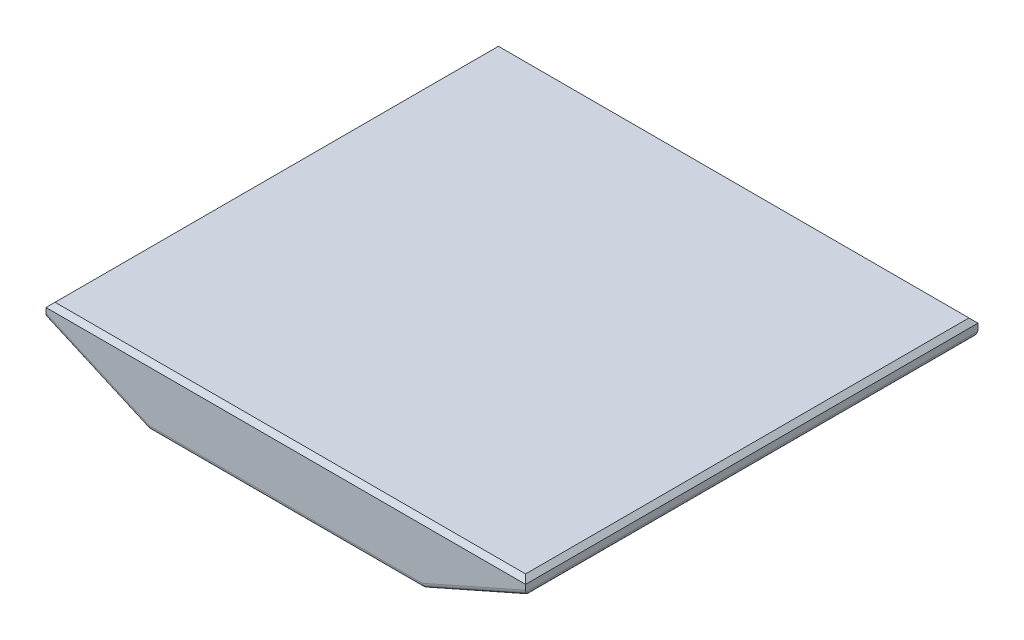
ISO-10303-21;
HEADER;
FILE_DESCRIPTION(('STEP AP214'),'2;1');
FILE_NAME('part.step','',(''),(''),'','','');
FILE_SCHEMA(('AUTOMOTIVE_DESIGN { 1 0 10303 214 1 1 1 1 }'));
ENDSEC;
DATA;
#1=APPLICATION_CONTEXT('core data for automotive mechanical design processes');
#2=APPLICATION_PROTOCOL_DEFINITION('international standard','automotive_design',2000,#1);
#3=PRODUCT_CONTEXT('',#1,'mechanical');
#4=PRODUCT('Part','Part','',(#3));
#5=PRODUCT_RELATED_PRODUCT_CATEGORY('part','',(#4));
#6=PRODUCT_DEFINITION_FORMATION('','',#4);
#7=PRODUCT_DEFINITION_CONTEXT('part definition',#1,'design');
#8=PRODUCT_DEFINITION('design','',#6,#7);
#9=PRODUCT_DEFINITION_SHAPE('','',#8);
#10=(LENGTH_UNIT() NAMED_UNIT(*) SI_UNIT(.MILLI.,.METRE.));
#11=(NAMED_UNIT(*) PLANE_ANGLE_UNIT() SI_UNIT($,.RADIAN.));
#12=(NAMED_UNIT(*) SI_UNIT($,.STERADIAN.) SOLID_ANGLE_UNIT());
#13=UNCERTAINTY_MEASURE_WITH_UNIT(LENGTH_MEASURE(1.E-05),#10,'distance_accuracy_value','');
#14=(GEOMETRIC_REPRESENTATION_CONTEXT(3) GLOBAL_UNCERTAINTY_ASSIGNED_CONTEXT((#13)) GLOBAL_UNIT_ASSIGNED_CONTEXT((#10,
#11,#12)) REPRESENTATION_CONTEXT('',''));
#15=CARTESIAN_POINT('',(0.,0.,0.));
#16=DIRECTION('',(0.,0.,1.));
#17=DIRECTION('',(1.,0.,0.));
#18=AXIS2_PLACEMENT_3D('',#15,#16,#17);
#19=CARTESIAN_POINT('',(26.5,0.,50.));
#20=DIRECTION('',(-1.,0.,0.));
#21=DIRECTION('',(0.,0.,1.));
#22=AXIS2_PLACEMENT_3D('',#19,#20,#21);
#23=PLANE('',#22);
#24=DIRECTION('',(0.,1.,0.));
#25=VECTOR('',#24,1.);
#26=CARTESIAN_POINT('',(26.5,0.,50.));
#27=LINE('',#26,#25);
#28=CARTESIAN_POINT('',(26.5,-1.05323984443737,50.));
#29=VERTEX_POINT('',#28);
#30=CARTESIAN_POINT('',(26.5,-0.499999999999987,50.));
#31=VERTEX_POINT('',#30);
#32=EDGE_CURVE('E381',#29,#31,#27,.T.);
#33=ORIENTED_EDGE('',*,*,#32,.F.);
#34=CARTESIAN_POINT('',(26.5,-1.05323984443737,49.5));
#35=DIRECTION('',(-1.,0.,0.));
#36=DIRECTION('',(0.,1.,0.));
#37=AXIS2_PLACEMENT_3D('',#34,#35,#36);
#38=ELLIPSE('',#37,0.546760155562622,0.5);
#39=CARTESIAN_POINT('',(26.5,-1.27447878249047,49.9572388778819));
#40=VERTEX_POINT('',#39);
#41=EDGE_CURVE('E227',#29,#40,#38,.F.);
#42=ORIENTED_EDGE('',*,*,#41,.T.);
#43=DIRECTION('',(0.,0.,-1.));
#44=VECTOR('',#43,1.);
#45=CARTESIAN_POINT('',(26.5,-1.27447878249047,50.));
#46=LINE('',#45,#44);
#47=CARTESIAN_POINT('',(26.5,-1.27447878249047,0.0427611221180749));
#48=VERTEX_POINT('',#47);
#49=EDGE_CURVE('E224',#40,#48,#46,.T.);
#50=ORIENTED_EDGE('',*,*,#49,.T.);
#51=CARTESIAN_POINT('',(26.5,-1.05323984443737,0.5));
#52=DIRECTION('',(-1.,0.,0.));
#53=DIRECTION('',(0.,-1.,0.));
#54=AXIS2_PLACEMENT_3D('',#51,#52,#53);
#55=ELLIPSE('',#54,0.546760155562622,0.5);
#56=CARTESIAN_POINT('',(26.5,-1.05323984443737,0.));
#57=VERTEX_POINT('',#56);
#58=EDGE_CURVE('E221',#48,#57,#55,.F.);
#59=ORIENTED_EDGE('',*,*,#58,.T.);
#60=DIRECTION('',(0.,1.,0.));
#61=VECTOR('',#60,1.);
#62=CARTESIAN_POINT('',(26.5,0.,0.));
#63=LINE('',#62,#61);
#64=CARTESIAN_POINT('',(26.5,-0.499999999999987,0.));
#65=VERTEX_POINT('',#64);
#66=EDGE_CURVE('E211',#57,#65,#63,.T.);
#67=ORIENTED_EDGE('',*,*,#66,.T.);
#68=DIRECTION('',(0.,0.,1.));
#69=VECTOR('',#68,1.);
#70=CARTESIAN_POINT('',(26.5,-0.499999999999987,50.));
#71=LINE('',#70,#69);
#72=EDGE_CURVE('E163',#65,#31,#71,.T.);
#73=ORIENTED_EDGE('',*,*,#72,.T.);
#74=EDGE_LOOP('',(#33,#42,#50,#59,#67,#73));
#75=FACE_BOUND('',#74,.T.);
#76=ADVANCED_FACE('F41',(#75),#23,.F.);
#77=CARTESIAN_POINT('',(-26.5,0.,50.));
#78=DIRECTION('',(0.,-1.,0.));
#79=DIRECTION('',(1.,0.,0.));
#80=AXIS2_PLACEMENT_3D('',#77,#78,#79);
#81=PLANE('',#80);
#82=DIRECTION('',(1.,0.,0.));
#83=VECTOR('',#82,1.);
#84=CARTESIAN_POINT('',(-26.5,0.,49.5));
#85=LINE('',#84,#83);
#86=CARTESIAN_POINT('',(-26.,0.,49.5));
#87=VERTEX_POINT('',#86);
#88=CARTESIAN_POINT('',(26.,0.,49.5));
#89=VERTEX_POINT('',#88);
#90=EDGE_CURVE('E182',#87,#89,#85,.T.);
#91=ORIENTED_EDGE('',*,*,#90,.T.);
#92=DIRECTION('',(0.,0.,-1.));
#93=VECTOR('',#92,1.);
#94=CARTESIAN_POINT('',(26.,0.,50.));
#95=LINE('',#94,#93);
#96=CARTESIAN_POINT('',(26.,0.,0.499999999999994));
#97=VERTEX_POINT('',#96);
#98=EDGE_CURVE('E161',#89,#97,#95,.T.);
#99=ORIENTED_EDGE('',*,*,#98,.T.);
#100=DIRECTION('',(-1.,0.,0.));
#101=VECTOR('',#100,1.);
#102=CARTESIAN_POINT('',(-26.5,0.,0.499999999999994));
#103=LINE('',#102,#101);
#104=CARTESIAN_POINT('',(-26.,0.,0.499999999999994));
#105=VERTEX_POINT('',#104);
#106=EDGE_CURVE('E170',#97,#105,#103,.T.);
#107=ORIENTED_EDGE('',*,*,#106,.T.);
#108=DIRECTION('',(0.,0.,1.));
#109=VECTOR('',#108,1.);
#110=CARTESIAN_POINT('',(-26.,0.,50.));
#111=LINE('',#110,#109);
#112=EDGE_CURVE('E177',#105,#87,#111,.T.);
#113=ORIENTED_EDGE('',*,*,#112,.T.);
#114=EDGE_LOOP('',(#91,#99,#107,#113));
#115=FACE_BOUND('',#114,.T.);
#116=ADVANCED_FACE('F180',(#115),#81,.F.);
#117=CARTESIAN_POINT('',(-26.5,0.,50.));
#118=DIRECTION('',(1.,0.,0.));
#119=DIRECTION('',(0.,0.,-1.));
#120=AXIS2_PLACEMENT_3D('',#117,#118,#119);
#121=PLANE('',#120);
#122=DIRECTION('',(0.,0.,-1.));
#123=VECTOR('',#122,1.);
#124=CARTESIAN_POINT('',(-26.5,-1.27447878249048,50.));
#125=LINE('',#124,#123);
#126=CARTESIAN_POINT('',(-26.5,-1.27447878249048,0.0427611221180749));
#127=VERTEX_POINT('',#126);
#128=CARTESIAN_POINT('',(-26.5,-1.27447878249048,49.9572388778819));
#129=VERTEX_POINT('',#128);
#130=EDGE_CURVE('E51',#127,#129,#125,.F.);
#131=ORIENTED_EDGE('',*,*,#130,.T.);
#132=CARTESIAN_POINT('',(-26.5,-1.05323984443738,49.5));
#133=DIRECTION('',(1.,0.,0.));
#134=DIRECTION('',(0.,-1.,0.));
#135=AXIS2_PLACEMENT_3D('',#132,#133,#134);
#136=ELLIPSE('',#135,0.546760155562622,0.5);
#137=CARTESIAN_POINT('',(-26.5,-1.05323984443738,50.));
#138=VERTEX_POINT('',#137);
#139=EDGE_CURVE('E11',#129,#138,#136,.F.);
#140=ORIENTED_EDGE('',*,*,#139,.T.);
#141=DIRECTION('',(0.,-1.,0.));
#142=VECTOR('',#141,1.);
#143=CARTESIAN_POINT('',(-26.5,0.,50.));
#144=LINE('',#143,#142);
#145=CARTESIAN_POINT('',(-26.5,-0.499999999999993,50.));
#146=VERTEX_POINT('',#145);
#147=EDGE_CURVE('E178',#146,#138,#144,.T.);
#148=ORIENTED_EDGE('',*,*,#147,.F.);
#149=DIRECTION('',(0.,0.,-1.));
#150=VECTOR('',#149,1.);
#151=CARTESIAN_POINT('',(-26.5,-0.499999999999993,50.));
#152=LINE('',#151,#150);
#153=CARTESIAN_POINT('',(-26.5,-0.499999999999994,0.));
#154=VERTEX_POINT('',#153);
#155=EDGE_CURVE('E195',#146,#154,#152,.T.);
#156=ORIENTED_EDGE('',*,*,#155,.T.);
#157=DIRECTION('',(0.,-1.,0.));
#158=VECTOR('',#157,1.);
#159=CARTESIAN_POINT('',(-26.5,0.,0.));
#160=LINE('',#159,#158);
#161=CARTESIAN_POINT('',(-26.5,-1.05323984443738,0.));
#162=VERTEX_POINT('',#161);
#163=EDGE_CURVE('E395',#154,#162,#160,.T.);
#164=ORIENTED_EDGE('',*,*,#163,.T.);
#165=CARTESIAN_POINT('',(-26.5,-1.05323984443738,0.5));
#166=DIRECTION('',(1.,0.,0.));
#167=DIRECTION('',(0.,1.,0.));
#168=AXIS2_PLACEMENT_3D('',#165,#166,#167);
#169=ELLIPSE('',#168,0.546760155562622,0.5);
#170=EDGE_CURVE('E62',#162,#127,#169,.F.);
#171=ORIENTED_EDGE('',*,*,#170,.T.);
#172=EDGE_LOOP('',(#131,#140,#148,#156,#164,#171));
#173=FACE_BOUND('',#172,.T.);
#174=ADVANCED_FACE('F377',(#173),#121,.F.);
#175=CARTESIAN_POINT('',(-26.5,-1.6,50.));
#176=DIRECTION('',(0.404636175116748,0.91447775576385,0.));
#177=DIRECTION('',(-0.91447775576385,0.404636175116748,0.));
#178=AXIS2_PLACEMENT_3D('',#175,#176,#177);
#179=PLANE('',#178);
#180=DIRECTION('',(0.91447775576385,-0.404636175116748,0.));
#181=VECTOR('',#180,1.);
#182=CARTESIAN_POINT('',(-26.5,-1.6,49.5));
#183=LINE('',#182,#181);
#184=CARTESIAN_POINT('',(-15.2966401359868,-6.55723887788193,49.5));
#185=VERTEX_POINT('',#184);
#186=CARTESIAN_POINT('',(-26.2023180875584,-1.7317176603724,49.5));
#187=VERTEX_POINT('',#186);
#188=EDGE_CURVE('E271',#185,#187,#183,.F.);
#189=ORIENTED_EDGE('',*,*,#188,.T.);
#190=DIRECTION('',(0.,0.,-1.));
#191=VECTOR('',#190,1.);
#192=CARTESIAN_POINT('',(-26.2023180875584,-1.7317176603724,50.));
#193=LINE('',#192,#191);
#194=CARTESIAN_POINT('',(-26.2023180875584,-1.7317176603724,0.5));
#195=VERTEX_POINT('',#194);
#196=EDGE_CURVE('E274',#187,#195,#193,.T.);
#197=ORIENTED_EDGE('',*,*,#196,.T.);
#198=DIRECTION('',(0.91447775576385,-0.404636175116748,0.));
#199=VECTOR('',#198,1.);
#200=CARTESIAN_POINT('',(-15.2,-6.6,0.5));
#201=LINE('',#200,#199);
#202=CARTESIAN_POINT('',(-15.2966401359868,-6.55723887788193,0.5));
#203=VERTEX_POINT('',#202);
#204=EDGE_CURVE('E265',#195,#203,#201,.T.);
#205=ORIENTED_EDGE('',*,*,#204,.T.);
#206=DIRECTION('',(0.,0.,-1.));
#207=VECTOR('',#206,1.);
#208=CARTESIAN_POINT('',(-15.2966401359868,-6.55723887788193,50.));
#209=LINE('',#208,#207);
#210=EDGE_CURVE('E268',#203,#185,#209,.F.);
#211=ORIENTED_EDGE('',*,*,#210,.T.);
#212=EDGE_LOOP('',(#189,#197,#205,#211));
#213=FACE_BOUND('',#212,.T.);
#214=ADVANCED_FACE('F350',(#213),#179,.F.);
#215=CARTESIAN_POINT('',(15.2,-6.6,50.));
#216=DIRECTION('',(0.,1.,0.));
#217=DIRECTION('',(-1.,0.,0.));
#218=AXIS2_PLACEMENT_3D('',#215,#216,#217);
#219=PLANE('',#218);
#220=DIRECTION('',(0.,0.,-1.));
#221=VECTOR('',#220,1.);
#222=CARTESIAN_POINT('',(15.0943220484285,-6.6,50.));
#223=LINE('',#222,#221);
#224=CARTESIAN_POINT('',(15.0943220484285,-6.6,0.5));
#225=VERTEX_POINT('',#224);
#226=CARTESIAN_POINT('',(15.0943220484285,-6.6,49.5));
#227=VERTEX_POINT('',#226);
#228=EDGE_CURVE('E258',#225,#227,#223,.F.);
#229=ORIENTED_EDGE('',*,*,#228,.T.);
#230=DIRECTION('',(1.,0.,0.));
#231=VECTOR('',#230,1.);
#232=CARTESIAN_POINT('',(15.2,-6.6,49.5));
#233=LINE('',#232,#231);
#234=CARTESIAN_POINT('',(-15.0943220484285,-6.6,49.5));
#235=VERTEX_POINT('',#234);
#236=EDGE_CURVE('E261',#227,#235,#233,.F.);
#237=ORIENTED_EDGE('',*,*,#236,.T.);
#238=DIRECTION('',(0.,0.,-1.));
#239=VECTOR('',#238,1.);
#240=CARTESIAN_POINT('',(-15.0943220484285,-6.6,50.));
#241=LINE('',#240,#239);
#242=CARTESIAN_POINT('',(-15.0943220484285,-6.6,0.5));
#243=VERTEX_POINT('',#242);
#244=EDGE_CURVE('E252',#235,#243,#241,.T.);
#245=ORIENTED_EDGE('',*,*,#244,.T.);
#246=DIRECTION('',(1.,0.,0.));
#247=VECTOR('',#246,1.);
#248=CARTESIAN_POINT('',(15.2,-6.6,0.5));
#249=LINE('',#248,#247);
#250=EDGE_CURVE('E255',#243,#225,#249,.T.);
#251=ORIENTED_EDGE('',*,*,#250,.T.);
#252=EDGE_LOOP('',(#229,#237,#245,#251));
#253=FACE_BOUND('',#252,.T.);
#254=ADVANCED_FACE('F426',(#253),#219,.F.);
#255=CARTESIAN_POINT('',(26.5,-1.59999999999999,50.));
#256=DIRECTION('',(-0.404636175116748,0.91447775576385,0.));
#257=DIRECTION('',(-0.91447775576385,-0.404636175116748,0.));
#258=AXIS2_PLACEMENT_3D('',#255,#256,#257);
#259=PLANE('',#258);
#260=DIRECTION('',(0.,0.,-1.));
#261=VECTOR('',#260,1.);
#262=CARTESIAN_POINT('',(26.2023180875584,-1.73171766037239,50.));
#263=LINE('',#262,#261);
#264=CARTESIAN_POINT('',(26.2023180875584,-1.73171766037239,0.5));
#265=VERTEX_POINT('',#264);
#266=CARTESIAN_POINT('',(26.2023180875584,-1.73171766037239,49.5));
#267=VERTEX_POINT('',#266);
#268=EDGE_CURVE('E236',#265,#267,#263,.F.);
#269=ORIENTED_EDGE('',*,*,#268,.T.);
#270=DIRECTION('',(0.91447775576385,0.404636175116748,0.));
#271=VECTOR('',#270,1.);
#272=CARTESIAN_POINT('',(26.5,-1.59999999999999,49.5));
#273=LINE('',#272,#271);
#274=CARTESIAN_POINT('',(15.2966401359868,-6.55723887788192,49.5));
#275=VERTEX_POINT('',#274);
#276=EDGE_CURVE('E239',#267,#275,#273,.F.);
#277=ORIENTED_EDGE('',*,*,#276,.T.);
#278=DIRECTION('',(0.,0.,-1.));
#279=VECTOR('',#278,1.);
#280=CARTESIAN_POINT('',(15.2966401359869,-6.55723887788192,50.));
#281=LINE('',#280,#279);
#282=CARTESIAN_POINT('',(15.2966401359868,-6.55723887788192,0.5));
#283=VERTEX_POINT('',#282);
#284=EDGE_CURVE('E230',#275,#283,#281,.T.);
#285=ORIENTED_EDGE('',*,*,#284,.T.);
#286=DIRECTION('',(0.91447775576385,0.404636175116748,0.));
#287=VECTOR('',#286,1.);
#288=CARTESIAN_POINT('',(26.5,-1.59999999999999,0.5));
#289=LINE('',#288,#287);
#290=EDGE_CURVE('E233',#283,#265,#289,.T.);
#291=ORIENTED_EDGE('',*,*,#290,.T.);
#292=EDGE_LOOP('',(#269,#277,#285,#291));
#293=FACE_BOUND('',#292,.T.);
#294=ADVANCED_FACE('F419',(#293),#259,.F.);
#295=CARTESIAN_POINT('',(0.,0.,50.));
#296=DIRECTION('',(0.,0.,-1.));
#297=DIRECTION('',(-1.,0.,0.));
#298=AXIS2_PLACEMENT_3D('',#295,#296,#297);
#299=PLANE('',#298);
#300=DIRECTION('',(1.,0.,0.));
#301=VECTOR('',#300,1.);
#302=CARTESIAN_POINT('',(0.,-6.1,50.));
#303=LINE('',#302,#301);
#304=CARTESIAN_POINT('',(-15.0943220484285,-6.1,50.));
#305=VERTEX_POINT('',#304);
#306=CARTESIAN_POINT('',(15.0943220484285,-6.1,50.));
#307=VERTEX_POINT('',#306);
#308=EDGE_CURVE('E214',#305,#307,#303,.T.);
#309=ORIENTED_EDGE('',*,*,#308,.T.);
#310=DIRECTION('',(0.91447775576385,0.404636175116748,0.));
#311=VECTOR('',#310,1.);
#312=CARTESIAN_POINT('',(4.7285876692037,-10.6866081324003,50.));
#313=LINE('',#312,#311);
#314=EDGE_CURVE('E217',#307,#29,#313,.T.);
#315=ORIENTED_EDGE('',*,*,#314,.T.);
#316=ORIENTED_EDGE('',*,*,#32,.T.);
#317=DIRECTION('',(-1.,0.,0.));
#318=VECTOR('',#317,1.);
#319=CARTESIAN_POINT('',(0.,-0.49999999999999,50.));
#320=LINE('',#319,#318);
#321=EDGE_CURVE('E188',#31,#146,#320,.T.);
#322=ORIENTED_EDGE('',*,*,#321,.T.);
#323=ORIENTED_EDGE('',*,*,#147,.T.);
#324=DIRECTION('',(0.91447775576385,-0.404636175116748,0.));
#325=VECTOR('',#324,1.);
#326=CARTESIAN_POINT('',(-4.7285876692037,-10.6866081324004,50.));
#327=LINE('',#326,#325);
#328=EDGE_CURVE('E201',#138,#305,#327,.T.);
#329=ORIENTED_EDGE('',*,*,#328,.T.);
#330=EDGE_LOOP('',(#309,#315,#316,#322,#323,#329));
#331=FACE_BOUND('',#330,.T.);
#332=ADVANCED_FACE('F372',(#331),#299,.F.);
#333=CARTESIAN_POINT('',(0.,0.,0.));
#334=DIRECTION('',(0.,0.,-1.));
#335=DIRECTION('',(-1.,0.,0.));
#336=AXIS2_PLACEMENT_3D('',#333,#334,#335);
#337=PLANE('',#336);
#338=ORIENTED_EDGE('',*,*,#66,.F.);
#339=DIRECTION('',(0.91447775576385,0.404636175116748,0.));
#340=VECTOR('',#339,1.);
#341=CARTESIAN_POINT('',(14.9976819124416,-6.14276112211807,0.));
#342=LINE('',#341,#340);
#343=CARTESIAN_POINT('',(15.0943220484285,-6.1,0.));
#344=VERTEX_POINT('',#343);
#345=EDGE_CURVE('E249',#57,#344,#342,.F.);
#346=ORIENTED_EDGE('',*,*,#345,.T.);
#347=DIRECTION('',(1.,0.,0.));
#348=VECTOR('',#347,1.);
#349=CARTESIAN_POINT('',(-15.2,-6.1,0.));
#350=LINE('',#349,#348);
#351=CARTESIAN_POINT('',(-15.0943220484285,-6.1,0.));
#352=VERTEX_POINT('',#351);
#353=EDGE_CURVE('E246',#344,#352,#350,.F.);
#354=ORIENTED_EDGE('',*,*,#353,.T.);
#355=DIRECTION('',(0.91447775576385,-0.404636175116748,0.));
#356=VECTOR('',#355,1.);
#357=CARTESIAN_POINT('',(-26.2976819124416,-1.14276112211808,0.));
#358=LINE('',#357,#356);
#359=EDGE_CURVE('E243',#352,#162,#358,.F.);
#360=ORIENTED_EDGE('',*,*,#359,.T.);
#361=ORIENTED_EDGE('',*,*,#163,.F.);
#362=DIRECTION('',(1.,0.,0.));
#363=VECTOR('',#362,1.);
#364=CARTESIAN_POINT('',(26.5,-0.499999999999987,0.));
#365=LINE('',#364,#363);
#366=EDGE_CURVE('E198',#154,#65,#365,.T.);
#367=ORIENTED_EDGE('',*,*,#366,.T.);
#368=EDGE_LOOP('',(#338,#346,#354,#360,#361,#367));
#369=FACE_BOUND('',#368,.T.);
#370=ADVANCED_FACE('F397',(#369),#337,.T.);
#371=CARTESIAN_POINT('',(-26.5,-0.499999999999993,50.));
#372=DIRECTION('',(0.707106781186547,-0.707106781186547,0.));
#373=DIRECTION('',(0.,0.,-1.));
#374=AXIS2_PLACEMENT_3D('',#371,#372,#373);
#375=PLANE('',#374);
#376=DIRECTION('',(-0.577350269189626,-0.577350269189626,-0.577350269189626));
#377=VECTOR('',#376,1.);
#378=CARTESIAN_POINT('',(-26.1666666666667,-0.166666666666664,0.333333333333329));
#379=LINE('',#378,#377);
#380=EDGE_CURVE('E173',#154,#105,#379,.F.);
#381=ORIENTED_EDGE('',*,*,#380,.F.);
#382=ORIENTED_EDGE('',*,*,#155,.F.);
#383=DIRECTION('',(0.577350269189626,0.577350269189626,-0.577350269189626));
#384=VECTOR('',#383,1.);
#385=CARTESIAN_POINT('',(-26.5,-0.499999999999993,50.));
#386=LINE('',#385,#384);
#387=EDGE_CURVE('E207',#87,#146,#386,.F.);
#388=ORIENTED_EDGE('',*,*,#387,.F.);
#389=ORIENTED_EDGE('',*,*,#112,.F.);
#390=EDGE_LOOP('',(#381,#382,#388,#389));
#391=FACE_BOUND('',#390,.T.);
#392=ADVANCED_FACE('F385',(#391),#375,.F.);
#393=CARTESIAN_POINT('',(0.,-0.49999999999999,50.));
#394=DIRECTION('',(0.,-0.707106781186547,-0.707106781186547));
#395=DIRECTION('',(-1.,0.,0.));
#396=AXIS2_PLACEMENT_3D('',#393,#394,#395);
#397=PLANE('',#396);
#398=ORIENTED_EDGE('',*,*,#387,.T.);
#399=ORIENTED_EDGE('',*,*,#321,.F.);
#400=DIRECTION('',(-0.577350269189626,0.577350269189626,-0.577350269189626));
#401=VECTOR('',#400,1.);
#402=CARTESIAN_POINT('',(17.6666666666667,8.33333333333334,41.1666666666667));
#403=LINE('',#402,#401);
#404=EDGE_CURVE('E167',#89,#31,#403,.F.);
#405=ORIENTED_EDGE('',*,*,#404,.F.);
#406=ORIENTED_EDGE('',*,*,#90,.F.);
#407=EDGE_LOOP('',(#398,#399,#405,#406));
#408=FACE_BOUND('',#407,.T.);
#409=ADVANCED_FACE('F388',(#408),#397,.F.);
#410=CARTESIAN_POINT('',(-26.5,0.,0.499999999999994));
#411=DIRECTION('',(0.,0.707106781186547,-0.707106781186547));
#412=DIRECTION('',(1.,0.,0.));
#413=AXIS2_PLACEMENT_3D('',#410,#411,#412);
#414=PLANE('',#413);
#415=ORIENTED_EDGE('',*,*,#380,.T.);
#416=ORIENTED_EDGE('',*,*,#106,.F.);
#417=DIRECTION('',(-0.577350269189626,0.577350269189626,0.577350269189626));
#418=VECTOR('',#417,1.);
#419=CARTESIAN_POINT('',(8.50000000000001,17.5,18.));
#420=LINE('',#419,#418);
#421=EDGE_CURVE('E156',#65,#97,#420,.T.);
#422=ORIENTED_EDGE('',*,*,#421,.F.);
#423=ORIENTED_EDGE('',*,*,#366,.F.);
#424=EDGE_LOOP('',(#415,#416,#422,#423));
#425=FACE_BOUND('',#424,.T.);
#426=ADVANCED_FACE('F171',(#425),#414,.T.);
#427=CARTESIAN_POINT('',(26.,0.,50.));
#428=DIRECTION('',(-0.707106781186547,-0.707106781186547,0.));
#429=DIRECTION('',(0.,0.,-1.));
#430=AXIS2_PLACEMENT_3D('',#427,#428,#429);
#431=PLANE('',#430);
#432=ORIENTED_EDGE('',*,*,#404,.T.);
#433=ORIENTED_EDGE('',*,*,#72,.F.);
#434=ORIENTED_EDGE('',*,*,#421,.T.);
#435=ORIENTED_EDGE('',*,*,#98,.F.);
#436=EDGE_LOOP('',(#432,#433,#434,#435));
#437=FACE_BOUND('',#436,.T.);
#438=ADVANCED_FACE('F159',(#437),#431,.F.);
#439=CARTESIAN_POINT('',(-26.2976819124416,-1.14276112211807,0.5));
#440=DIRECTION('',(-0.91447775576385,0.404636175116748,0.));
#441=DIRECTION('',(-0.404636175116748,-0.91447775576385,0.));
#442=AXIS2_PLACEMENT_3D('',#439,#440,#441);
#443=CYLINDRICAL_SURFACE('',#442,0.5);
#444=CARTESIAN_POINT('',(-15.0943220484285,-6.1,0.5));
#445=DIRECTION('',(0.914477755763851,-0.404636175116747,0.));
#446=DIRECTION('',(0.404636175116747,0.914477755763851,0.));
#447=AXIS2_PLACEMENT_3D('',#444,#445,#446);
#448=CIRCLE('',#447,0.5);
#449=EDGE_CURVE('E335',#203,#352,#448,.T.);
#450=ORIENTED_EDGE('',*,*,#449,.F.);
#451=ORIENTED_EDGE('',*,*,#204,.F.);
#452=CARTESIAN_POINT('',(-26.,-1.27447878249048,0.5));
#453=DIRECTION('',(-0.646633422344874,0.28612098333844,0.707106781186547));
#454=DIRECTION('',(-0.646633422344874,0.28612098333844,-0.707106781186547));
#455=AXIS2_PLACEMENT_3D('',#452,#453,#454);
#456=ELLIPSE('',#455,0.707106781186547,0.5);
#457=EDGE_CURVE('E45',#127,#195,#456,.T.);
#458=ORIENTED_EDGE('',*,*,#457,.F.);
#459=ORIENTED_EDGE('',*,*,#170,.F.);
#460=ORIENTED_EDGE('',*,*,#359,.F.);
#461=EDGE_LOOP('',(#450,#451,#458,#459,#460));
#462=FACE_BOUND('',#461,.T.);
#463=ADVANCED_FACE('F43',(#462),#443,.T.);
#464=CARTESIAN_POINT('',(-26.,-1.27447878249048,50.));
#465=DIRECTION('',(0.,0.,-1.));
#466=DIRECTION('',(-1.,0.,0.));
#467=AXIS2_PLACEMENT_3D('',#464,#465,#466);
#468=CYLINDRICAL_SURFACE('',#467,0.5);
#469=ORIENTED_EDGE('',*,*,#457,.T.);
#470=ORIENTED_EDGE('',*,*,#196,.F.);
#471=CARTESIAN_POINT('',(-26.,-1.27447878249048,49.5));
#472=DIRECTION('',(0.646633422344874,-0.28612098333844,0.707106781186547));
#473=DIRECTION('',(0.646633422344874,-0.28612098333844,-0.707106781186547));
#474=AXIS2_PLACEMENT_3D('',#471,#472,#473);
#475=ELLIPSE('',#474,0.707106781186547,0.5);
#476=EDGE_CURVE('E328',#129,#187,#475,.T.);
#477=ORIENTED_EDGE('',*,*,#476,.F.);
#478=ORIENTED_EDGE('',*,*,#130,.F.);
#479=EDGE_LOOP('',(#469,#470,#477,#478));
#480=FACE_BOUND('',#479,.T.);
#481=ADVANCED_FACE('F346',(#480),#468,.T.);
#482=CARTESIAN_POINT('',(-15.0943220484285,-6.1,0.5));
#483=DIRECTION('',(0.,0.,-1.));
#484=DIRECTION('',(-1.,0.,0.));
#485=AXIS2_PLACEMENT_3D('',#482,#483,#484);
#486=SPHERICAL_SURFACE('',#485,0.5);
#487=CARTESIAN_POINT('',(-15.0943220484285,-6.1,0.5));
#488=DIRECTION('',(-1.,0.,0.));
#489=DIRECTION('',(0.,-1.,0.));
#490=AXIS2_PLACEMENT_3D('',#487,#488,#489);
#491=CIRCLE('',#490,0.5);
#492=EDGE_CURVE('E324',#243,#352,#491,.F.);
#493=ORIENTED_EDGE('',*,*,#492,.F.);
#494=CARTESIAN_POINT('',(-15.0943220484285,-6.1,0.5));
#495=DIRECTION('',(0.,0.,-1.));
#496=DIRECTION('',(-1.,0.,0.));
#497=AXIS2_PLACEMENT_3D('',#494,#495,#496);
#498=CIRCLE('',#497,0.5);
#499=EDGE_CURVE('E332',#203,#243,#498,.F.);
#500=ORIENTED_EDGE('',*,*,#499,.F.);
#501=ORIENTED_EDGE('',*,*,#449,.T.);
#502=EDGE_LOOP('',(#493,#500,#501));
#503=FACE_BOUND('',#502,.T.);
#504=ADVANCED_FACE('F427',(#503),#486,.T.);
#505=CARTESIAN_POINT('',(-15.0943220484285,-6.1,50.));
#506=DIRECTION('',(0.,0.,-1.));
#507=DIRECTION('',(-1.,0.,0.));
#508=AXIS2_PLACEMENT_3D('',#505,#506,#507);
#509=CYLINDRICAL_SURFACE('',#508,0.5);
#510=ORIENTED_EDGE('',*,*,#499,.T.);
#511=ORIENTED_EDGE('',*,*,#244,.F.);
#512=CARTESIAN_POINT('',(-15.0943220484285,-6.1,49.5));
#513=DIRECTION('',(0.,0.,1.));
#514=DIRECTION('',(1.,0.,0.));
#515=AXIS2_PLACEMENT_3D('',#512,#513,#514);
#516=CIRCLE('',#515,0.5);
#517=EDGE_CURVE('E320',#185,#235,#516,.T.);
#518=ORIENTED_EDGE('',*,*,#517,.F.);
#519=ORIENTED_EDGE('',*,*,#210,.F.);
#520=EDGE_LOOP('',(#510,#511,#518,#519));
#521=FACE_BOUND('',#520,.T.);
#522=ADVANCED_FACE('F362',(#521),#509,.T.);
#523=CARTESIAN_POINT('',(-4.7285876692037,-10.6866081324003,49.5));
#524=DIRECTION('',(0.91447775576385,-0.404636175116748,0.));
#525=DIRECTION('',(0.404636175116748,0.91447775576385,0.));
#526=AXIS2_PLACEMENT_3D('',#523,#524,#525);
#527=CYLINDRICAL_SURFACE('',#526,0.5);
#528=ORIENTED_EDGE('',*,*,#476,.T.);
#529=ORIENTED_EDGE('',*,*,#188,.F.);
#530=CARTESIAN_POINT('',(-15.0943220484285,-6.1,49.5));
#531=DIRECTION('',(0.914477755763852,-0.404636175116745,0.));
#532=DIRECTION('',(0.404636175116745,0.914477755763852,0.));
#533=AXIS2_PLACEMENT_3D('',#530,#531,#532);
#534=CIRCLE('',#533,0.5);
#535=EDGE_CURVE('E316',#305,#185,#534,.T.);
#536=ORIENTED_EDGE('',*,*,#535,.F.);
#537=ORIENTED_EDGE('',*,*,#328,.F.);
#538=ORIENTED_EDGE('',*,*,#139,.F.);
#539=EDGE_LOOP('',(#528,#529,#536,#537,#538));
#540=FACE_BOUND('',#539,.T.);
#541=ADVANCED_FACE('F356',(#540),#527,.T.);
#542=CARTESIAN_POINT('',(15.2,-6.1,0.5));
#543=DIRECTION('',(-1.,0.,0.));
#544=DIRECTION('',(0.,-1.,0.));
#545=AXIS2_PLACEMENT_3D('',#542,#543,#544);
#546=CYLINDRICAL_SURFACE('',#545,0.5);
#547=ORIENTED_EDGE('',*,*,#492,.T.);
#548=ORIENTED_EDGE('',*,*,#353,.F.);
#549=CARTESIAN_POINT('',(15.0943220484285,-6.1,0.5));
#550=DIRECTION('',(1.,0.,0.));
#551=DIRECTION('',(0.,0.,-1.));
#552=AXIS2_PLACEMENT_3D('',#549,#550,#551);
#553=CIRCLE('',#552,0.5);
#554=EDGE_CURVE('E312',#225,#344,#553,.T.);
#555=ORIENTED_EDGE('',*,*,#554,.F.);
#556=ORIENTED_EDGE('',*,*,#250,.F.);
#557=EDGE_LOOP('',(#547,#548,#555,#556));
#558=FACE_BOUND('',#557,.T.);
#559=ADVANCED_FACE('F406',(#558),#546,.T.);
#560=CARTESIAN_POINT('',(-15.0943220484285,-6.1,49.5));
#561=DIRECTION('',(0.,0.,1.));
#562=DIRECTION('',(1.,0.,0.));
#563=AXIS2_PLACEMENT_3D('',#560,#561,#562);
#564=SPHERICAL_SURFACE('',#563,0.5);
#565=ORIENTED_EDGE('',*,*,#535,.T.);
#566=ORIENTED_EDGE('',*,*,#517,.T.);
#567=CARTESIAN_POINT('',(-15.0943220484285,-6.1,49.5));
#568=DIRECTION('',(-1.,0.,0.));
#569=DIRECTION('',(0.,0.,1.));
#570=AXIS2_PLACEMENT_3D('',#567,#568,#569);
#571=CIRCLE('',#570,0.5);
#572=EDGE_CURVE('E305',#305,#235,#571,.F.);
#573=ORIENTED_EDGE('',*,*,#572,.F.);
#574=EDGE_LOOP('',(#565,#566,#573));
#575=FACE_BOUND('',#574,.T.);
#576=ADVANCED_FACE('F364',(#575),#564,.T.);
#577=CARTESIAN_POINT('',(15.0943220484285,-6.1,0.5));
#578=DIRECTION('',(0.,0.,-1.));
#579=DIRECTION('',(-1.,0.,0.));
#580=AXIS2_PLACEMENT_3D('',#577,#578,#579);
#581=SPHERICAL_SURFACE('',#580,0.5);
#582=CARTESIAN_POINT('',(15.0943220484285,-6.1,0.5));
#583=DIRECTION('',(-0.914477755763851,-0.404636175116747,0.));
#584=DIRECTION('',(0.404636175116747,-0.914477755763851,0.));
#585=AXIS2_PLACEMENT_3D('',#582,#583,#584);
#586=CIRCLE('',#585,0.5);
#587=EDGE_CURVE('E301',#283,#344,#586,.F.);
#588=ORIENTED_EDGE('',*,*,#587,.F.);
#589=CARTESIAN_POINT('',(15.0943220484285,-6.1,0.5));
#590=DIRECTION('',(0.,0.,-1.));
#591=DIRECTION('',(-1.,0.,0.));
#592=AXIS2_PLACEMENT_3D('',#589,#590,#591);
#593=CIRCLE('',#592,0.5);
#594=EDGE_CURVE('E308',#225,#283,#593,.F.);
#595=ORIENTED_EDGE('',*,*,#594,.F.);
#596=ORIENTED_EDGE('',*,*,#554,.T.);
#597=EDGE_LOOP('',(#588,#595,#596));
#598=FACE_BOUND('',#597,.T.);
#599=ADVANCED_FACE('F411',(#598),#581,.T.);
#600=CARTESIAN_POINT('',(15.0943220484285,-6.1,50.));
#601=DIRECTION('',(0.,0.,-1.));
#602=DIRECTION('',(-1.,0.,0.));
#603=AXIS2_PLACEMENT_3D('',#600,#601,#602);
#604=CYLINDRICAL_SURFACE('',#603,0.5);
#605=ORIENTED_EDGE('',*,*,#594,.T.);
#606=ORIENTED_EDGE('',*,*,#284,.F.);
#607=CARTESIAN_POINT('',(15.0943220484285,-6.1,49.5));
#608=DIRECTION('',(0.,0.,1.));
#609=DIRECTION('',(1.,0.,0.));
#610=AXIS2_PLACEMENT_3D('',#607,#608,#609);
#611=CIRCLE('',#610,0.5);
#612=EDGE_CURVE('E297',#227,#275,#611,.T.);
#613=ORIENTED_EDGE('',*,*,#612,.F.);
#614=ORIENTED_EDGE('',*,*,#228,.F.);
#615=EDGE_LOOP('',(#605,#606,#613,#614));
#616=FACE_BOUND('',#615,.T.);
#617=ADVANCED_FACE('F424',(#616),#604,.T.);
#618=CARTESIAN_POINT('',(0.,-6.1,49.5));
#619=DIRECTION('',(1.,0.,0.));
#620=DIRECTION('',(0.,1.,0.));
#621=AXIS2_PLACEMENT_3D('',#618,#619,#620);
#622=CYLINDRICAL_SURFACE('',#621,0.5);
#623=ORIENTED_EDGE('',*,*,#572,.T.);
#624=ORIENTED_EDGE('',*,*,#236,.F.);
#625=CARTESIAN_POINT('',(15.0943220484285,-6.1,49.5));
#626=DIRECTION('',(1.,0.,0.));
#627=DIRECTION('',(0.,1.,0.));
#628=AXIS2_PLACEMENT_3D('',#625,#626,#627);
#629=CIRCLE('',#628,0.5);
#630=EDGE_CURVE('E293',#307,#227,#629,.T.);
#631=ORIENTED_EDGE('',*,*,#630,.F.);
#632=ORIENTED_EDGE('',*,*,#308,.F.);
#633=EDGE_LOOP('',(#623,#624,#631,#632));
#634=FACE_BOUND('',#633,.T.);
#635=ADVANCED_FACE('F369',(#634),#622,.T.);
#636=CARTESIAN_POINT('',(26.2976819124416,-1.14276112211807,0.5));
#637=DIRECTION('',(-0.91447775576385,-0.404636175116748,0.));
#638=DIRECTION('',(0.404636175116748,-0.91447775576385,0.));
#639=AXIS2_PLACEMENT_3D('',#636,#637,#638);
#640=CYLINDRICAL_SURFACE('',#639,0.5);
#641=ORIENTED_EDGE('',*,*,#345,.F.);
#642=ORIENTED_EDGE('',*,*,#58,.F.);
#643=CARTESIAN_POINT('',(26.,-1.27447878249047,0.5));
#644=DIRECTION('',(-0.646633422344874,-0.28612098333844,-0.707106781186547));
#645=DIRECTION('',(-0.646633422344874,-0.28612098333844,0.707106781186547));
#646=AXIS2_PLACEMENT_3D('',#643,#644,#645);
#647=ELLIPSE('',#646,0.707106781186547,0.5);
#648=EDGE_CURVE('E289',#265,#48,#647,.F.);
#649=ORIENTED_EDGE('',*,*,#648,.F.);
#650=ORIENTED_EDGE('',*,*,#290,.F.);
#651=ORIENTED_EDGE('',*,*,#587,.T.);
#652=EDGE_LOOP('',(#641,#642,#649,#650,#651));
#653=FACE_BOUND('',#652,.T.);
#654=ADVANCED_FACE('F415',(#653),#640,.T.);
#655=CARTESIAN_POINT('',(15.0943220484285,-6.1,49.5));
#656=DIRECTION('',(0.,0.,1.));
#657=DIRECTION('',(1.,0.,0.));
#658=AXIS2_PLACEMENT_3D('',#655,#656,#657);
#659=SPHERICAL_SURFACE('',#658,0.5);
#660=ORIENTED_EDGE('',*,*,#630,.T.);
#661=ORIENTED_EDGE('',*,*,#612,.T.);
#662=CARTESIAN_POINT('',(15.0943220484285,-6.1,49.5));
#663=DIRECTION('',(-0.914477755763851,-0.404636175116747,0.));
#664=DIRECTION('',(0.404636175116747,-0.914477755763851,0.));
#665=AXIS2_PLACEMENT_3D('',#662,#663,#664);
#666=CIRCLE('',#665,0.5);
#667=EDGE_CURVE('E286',#307,#275,#666,.F.);
#668=ORIENTED_EDGE('',*,*,#667,.F.);
#669=EDGE_LOOP('',(#660,#661,#668));
#670=FACE_BOUND('',#669,.T.);
#671=ADVANCED_FACE('F470',(#670),#659,.T.);
#672=CARTESIAN_POINT('',(26.,-1.27447878249047,50.));
#673=DIRECTION('',(0.,0.,-1.));
#674=DIRECTION('',(-1.,0.,0.));
#675=AXIS2_PLACEMENT_3D('',#672,#673,#674);
#676=CYLINDRICAL_SURFACE('',#675,0.5);
#677=ORIENTED_EDGE('',*,*,#648,.T.);
#678=ORIENTED_EDGE('',*,*,#49,.F.);
#679=CARTESIAN_POINT('',(26.,-1.27447878249047,49.5));
#680=DIRECTION('',(0.646633422344874,0.28612098333844,-0.707106781186547));
#681=DIRECTION('',(-0.646633422344874,-0.28612098333844,-0.707106781186547));
#682=AXIS2_PLACEMENT_3D('',#679,#680,#681);
#683=ELLIPSE('',#682,0.707106781186547,0.5);
#684=EDGE_CURVE('E282',#267,#40,#683,.F.);
#685=ORIENTED_EDGE('',*,*,#684,.F.);
#686=ORIENTED_EDGE('',*,*,#268,.F.);
#687=EDGE_LOOP('',(#677,#678,#685,#686));
#688=FACE_BOUND('',#687,.T.);
#689=ADVANCED_FACE('F466',(#688),#676,.T.);
#690=CARTESIAN_POINT('',(4.7285876692037,-10.6866081324003,49.5));
#691=DIRECTION('',(0.91447775576385,0.404636175116748,0.));
#692=DIRECTION('',(-0.404636175116748,0.91447775576385,0.));
#693=AXIS2_PLACEMENT_3D('',#690,#691,#692);
#694=CYLINDRICAL_SURFACE('',#693,0.5);
#695=ORIENTED_EDGE('',*,*,#667,.T.);
#696=ORIENTED_EDGE('',*,*,#276,.F.);
#697=ORIENTED_EDGE('',*,*,#684,.T.);
#698=ORIENTED_EDGE('',*,*,#41,.F.);
#699=ORIENTED_EDGE('',*,*,#314,.F.);
#700=EDGE_LOOP('',(#695,#696,#697,#698,#699));
#701=FACE_BOUND('',#700,.T.);
#702=ADVANCED_FACE('F463',(#701),#694,.T.);
#703=CLOSED_SHELL('',(#76,#116,#174,#214,#254,#294,#332,#370,#392,#409,#426,#438,#463,#481,#504,
#522,#541,#559,#576,#599,#617,#635,#654,#671,#689,#702));
#704=MANIFOLD_SOLID_BREP('B2',#703);
#705=ADVANCED_BREP_SHAPE_REPRESENTATION('',(#18,#704),#14);
#706=SHAPE_DEFINITION_REPRESENTATION(#9,#705);
ENDSEC;
END-ISO-10303-21;
